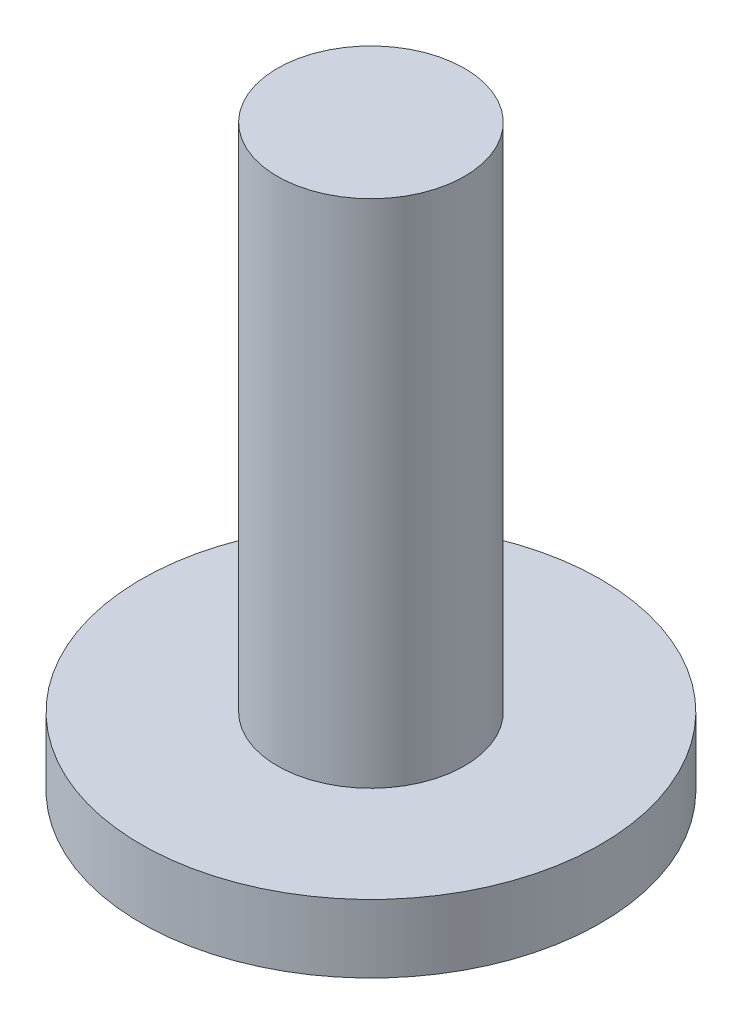
ISO-10303-21;
HEADER;
FILE_DESCRIPTION(('STEP AP214'),'2;1');
FILE_NAME('part.step','',(''),(''),'','','');
FILE_SCHEMA(('AUTOMOTIVE_DESIGN { 1 0 10303 214 1 1 1 1 }'));
ENDSEC;
DATA;
#1=APPLICATION_CONTEXT('core data for automotive mechanical design processes');
#2=APPLICATION_PROTOCOL_DEFINITION('international standard','automotive_design',2000,#1);
#3=PRODUCT_CONTEXT('',#1,'mechanical');
#4=PRODUCT('Part','Part','',(#3));
#5=PRODUCT_RELATED_PRODUCT_CATEGORY('part','',(#4));
#6=PRODUCT_DEFINITION_FORMATION('','',#4);
#7=PRODUCT_DEFINITION_CONTEXT('part definition',#1,'design');
#8=PRODUCT_DEFINITION('design','',#6,#7);
#9=PRODUCT_DEFINITION_SHAPE('','',#8);
#10=(LENGTH_UNIT() NAMED_UNIT(*) SI_UNIT(.MILLI.,.METRE.));
#11=(NAMED_UNIT(*) PLANE_ANGLE_UNIT() SI_UNIT($,.RADIAN.));
#12=(NAMED_UNIT(*) SI_UNIT($,.STERADIAN.) SOLID_ANGLE_UNIT());
#13=UNCERTAINTY_MEASURE_WITH_UNIT(LENGTH_MEASURE(1.E-05),#10,'distance_accuracy_value','');
#14=(GEOMETRIC_REPRESENTATION_CONTEXT(3) GLOBAL_UNCERTAINTY_ASSIGNED_CONTEXT((#13)) GLOBAL_UNIT_ASSIGNED_CONTEXT((#10,
#11,#12)) REPRESENTATION_CONTEXT('',''));
#15=CARTESIAN_POINT('',(0.,0.,0.));
#16=DIRECTION('',(0.,0.,1.));
#17=DIRECTION('',(1.,0.,0.));
#18=AXIS2_PLACEMENT_3D('',#15,#16,#17);
#19=CARTESIAN_POINT('',(-0.25,0.,-0.25));
#20=DIRECTION('',(0.,-1.,0.));
#21=DIRECTION('',(0.,0.,-1.));
#22=AXIS2_PLACEMENT_3D('',#19,#20,#21);
#23=PLANE('',#22);
#24=DIRECTION('',(0.,0.,-1.));
#25=VECTOR('',#24,1.);
#26=CARTESIAN_POINT('',(0.25,0.,1.15));
#27=LINE('',#26,#25);
#28=CARTESIAN_POINT('',(0.25,0.,0.25));
#29=VERTEX_POINT('',#28);
#30=CARTESIAN_POINT('',(0.25,0.,1.15));
#31=VERTEX_POINT('',#30);
#32=EDGE_CURVE('E245',#29,#31,#27,.F.);
#33=ORIENTED_EDGE('',*,*,#32,.T.);
#34=DIRECTION('',(1.,0.,0.));
#35=VECTOR('',#34,1.);
#36=CARTESIAN_POINT('',(-0.25,0.,1.15));
#37=LINE('',#36,#35);
#38=CARTESIAN_POINT('',(-0.25,0.,1.15));
#39=VERTEX_POINT('',#38);
#40=EDGE_CURVE('E246',#31,#39,#37,.F.);
#41=ORIENTED_EDGE('',*,*,#40,.T.);
#42=DIRECTION('',(0.,0.,1.));
#43=VECTOR('',#42,1.);
#44=CARTESIAN_POINT('',(-0.25,0.,0.25));
#45=LINE('',#44,#43);
#46=CARTESIAN_POINT('',(-0.25,0.,0.25));
#47=VERTEX_POINT('',#46);
#48=EDGE_CURVE('E243',#39,#47,#45,.F.);
#49=ORIENTED_EDGE('',*,*,#48,.T.);
#50=DIRECTION('',(1.,0.,0.));
#51=VECTOR('',#50,1.);
#52=CARTESIAN_POINT('',(-1.15,0.,0.25));
#53=LINE('',#52,#51);
#54=CARTESIAN_POINT('',(-1.15,0.,0.25));
#55=VERTEX_POINT('',#54);
#56=EDGE_CURVE('E306',#47,#55,#53,.F.);
#57=ORIENTED_EDGE('',*,*,#56,.T.);
#58=DIRECTION('',(0.,0.,1.));
#59=VECTOR('',#58,1.);
#60=CARTESIAN_POINT('',(-1.15,0.,-0.25));
#61=LINE('',#60,#59);
#62=CARTESIAN_POINT('',(-1.15,0.,-0.25));
#63=VERTEX_POINT('',#62);
#64=EDGE_CURVE('E112',#55,#63,#61,.F.);
#65=ORIENTED_EDGE('',*,*,#64,.T.);
#66=DIRECTION('',(-1.,0.,0.));
#67=VECTOR('',#66,1.);
#68=CARTESIAN_POINT('',(-0.25,0.,-0.25));
#69=LINE('',#68,#67);
#70=CARTESIAN_POINT('',(-0.25,0.,-0.25));
#71=VERTEX_POINT('',#70);
#72=EDGE_CURVE('E298',#63,#71,#69,.F.);
#73=ORIENTED_EDGE('',*,*,#72,.T.);
#74=DIRECTION('',(0.,0.,1.));
#75=VECTOR('',#74,1.);
#76=CARTESIAN_POINT('',(-0.25,0.,-1.15));
#77=LINE('',#76,#75);
#78=CARTESIAN_POINT('',(-0.25,0.,-1.15));
#79=VERTEX_POINT('',#78);
#80=EDGE_CURVE('E310',#71,#79,#77,.F.);
#81=ORIENTED_EDGE('',*,*,#80,.T.);
#82=DIRECTION('',(-1.,0.,0.));
#83=VECTOR('',#82,1.);
#84=CARTESIAN_POINT('',(0.25,0.,-1.15));
#85=LINE('',#84,#83);
#86=CARTESIAN_POINT('',(0.25,0.,-1.15));
#87=VERTEX_POINT('',#86);
#88=EDGE_CURVE('E315',#79,#87,#85,.F.);
#89=ORIENTED_EDGE('',*,*,#88,.T.);
#90=DIRECTION('',(0.,0.,-1.));
#91=VECTOR('',#90,1.);
#92=CARTESIAN_POINT('',(0.25,0.,-0.25));
#93=LINE('',#92,#91);
#94=CARTESIAN_POINT('',(0.25,0.,-0.25));
#95=VERTEX_POINT('',#94);
#96=EDGE_CURVE('E320',#87,#95,#93,.F.);
#97=ORIENTED_EDGE('',*,*,#96,.T.);
#98=DIRECTION('',(-1.,0.,0.));
#99=VECTOR('',#98,1.);
#100=CARTESIAN_POINT('',(1.15,0.,-0.25));
#101=LINE('',#100,#99);
#102=CARTESIAN_POINT('',(1.15,0.,-0.25));
#103=VERTEX_POINT('',#102);
#104=EDGE_CURVE('E265',#95,#103,#101,.F.);
#105=ORIENTED_EDGE('',*,*,#104,.T.);
#106=DIRECTION('',(0.,0.,-1.));
#107=VECTOR('',#106,1.);
#108=CARTESIAN_POINT('',(1.15,0.,0.25));
#109=LINE('',#108,#107);
#110=CARTESIAN_POINT('',(1.15,0.,0.25));
#111=VERTEX_POINT('',#110);
#112=EDGE_CURVE('E266',#103,#111,#109,.F.);
#113=ORIENTED_EDGE('',*,*,#112,.T.);
#114=DIRECTION('',(1.,0.,0.));
#115=VECTOR('',#114,1.);
#116=CARTESIAN_POINT('',(0.25,0.,0.25));
#117=LINE('',#116,#115);
#118=EDGE_CURVE('E252',#111,#29,#117,.F.);
#119=ORIENTED_EDGE('',*,*,#118,.T.);
#120=EDGE_LOOP('',(#33,#41,#49,#57,#65,#73,#81,#89,#97,#105,#113,#119));
#121=FACE_BOUND('',#120,.T.);
#122=ADVANCED_FACE('F16',(#121),#23,.T.);
#123=CARTESIAN_POINT('',(-1.15,-0.701,0.25));
#124=DIRECTION('',(0.,0.,1.));
#125=DIRECTION('',(1.,0.,0.));
#126=AXIS2_PLACEMENT_3D('',#123,#124,#125);
#127=PLANE('',#126);
#128=ORIENTED_EDGE('',*,*,#56,.F.);
#129=DIRECTION('',(0.,1.,0.));
#130=VECTOR('',#129,1.);
#131=CARTESIAN_POINT('',(-0.25,-0.701,0.25));
#132=LINE('',#131,#130);
#133=CARTESIAN_POINT('',(-0.250000000000001,-0.684344362627307,0.25));
#134=VERTEX_POINT('',#133);
#135=EDGE_CURVE('E126',#47,#134,#132,.F.);
#136=ORIENTED_EDGE('',*,*,#135,.T.);
#137=CARTESIAN_POINT('',(-1.15,-0.522956970723055,0.249999999999999));
#138=CARTESIAN_POINT('',(-1.11333135868953,-0.533987591681998,0.25));
#139=CARTESIAN_POINT('',(-1.07650393543152,-0.544490328830552,0.25));
#140=CARTESIAN_POINT('',(-1.00265322402775,-0.564407485830237,0.25));
#141=CARTESIAN_POINT('',(-0.965630641332971,-0.573824521468512,0.25));
#142=CARTESIAN_POINT('',(-0.891391412885177,-0.591577534689035,0.25));
#143=CARTESIAN_POINT('',(-0.854175185287187,-0.599915260929063,0.25));
#144=CARTESIAN_POINT('',(-0.779549847545446,-0.615514510882615,0.25));
#145=CARTESIAN_POINT('',(-0.742140921447066,-0.622776915062276,0.25));
#146=CARTESIAN_POINT('',(-0.667130482600741,-0.636227736274504,0.25));
#147=CARTESIAN_POINT('',(-0.629528969852796,-0.642416153307071,0.250000000000002));
#148=CARTESIAN_POINT('',(-0.554133132106234,-0.653718599178492,0.249999999999998));
#149=CARTESIAN_POINT('',(-0.516338673753794,-0.658831738461234,0.249999999999994));
#150=CARTESIAN_POINT('',(-0.440556528913868,-0.667980456534941,0.250000000000006));
#151=CARTESIAN_POINT('',(-0.402568626928616,-0.672014250327762,0.250000000000023));
#152=CARTESIAN_POINT('',(-0.326398825852574,-0.678998670262816,0.249999999999977));
#153=CARTESIAN_POINT('',(-0.288216679361581,-0.681946598480549,0.249999999999914));
#154=CARTESIAN_POINT('',(-0.250000000000439,-0.684344362627288,0.249999999999761));
#155=B_SPLINE_CURVE_WITH_KNOTS('',3,(#137,#138,#139,#140,#141,#142,#143,#144,#145,#146,#147,
#148,#149,#150,#151,#152,#153,#154),.UNSPECIFIED.,.F.,.F.,(4,2,2,2,2,2,2,2,4),(0.,
0.11487148592168,0.229460156947218,0.343860787912718,0.458167224214226,0.572473660515734,
0.686874291481233,0.801462962506772,0.916334448428451),.UNSPECIFIED.);
#156=CARTESIAN_POINT('',(-1.15,-0.522956970723055,0.25));
#157=VERTEX_POINT('',#156);
#158=EDGE_CURVE('E19',#157,#134,#155,.T.);
#159=ORIENTED_EDGE('',*,*,#158,.F.);
#160=DIRECTION('',(0.,1.,0.));
#161=VECTOR('',#160,1.);
#162=CARTESIAN_POINT('',(-1.15,-0.701,0.25));
#163=LINE('',#162,#161);
#164=EDGE_CURVE('E115',#157,#55,#163,.T.);
#165=ORIENTED_EDGE('',*,*,#164,.T.);
#166=EDGE_LOOP('',(#128,#136,#159,#165));
#167=FACE_BOUND('',#166,.T.);
#168=ADVANCED_FACE('F124',(#167),#127,.F.);
#169=CARTESIAN_POINT('',(-0.25,-0.701,0.25));
#170=DIRECTION('',(-1.,0.,0.));
#171=DIRECTION('',(0.,0.,1.));
#172=AXIS2_PLACEMENT_3D('',#169,#170,#171);
#173=PLANE('',#172);
#174=ORIENTED_EDGE('',*,*,#48,.F.);
#175=DIRECTION('',(0.,1.,0.));
#176=VECTOR('',#175,1.);
#177=CARTESIAN_POINT('',(-0.25,-0.701,1.15));
#178=LINE('',#177,#176);
#179=CARTESIAN_POINT('',(-0.25,-0.522956970723054,1.15));
#180=VERTEX_POINT('',#179);
#181=EDGE_CURVE('E242',#39,#180,#178,.F.);
#182=ORIENTED_EDGE('',*,*,#181,.T.);
#183=CARTESIAN_POINT('',(-0.250000000000001,3.3,0.));
#184=DIRECTION('',(-1.,0.,0.));
#185=DIRECTION('',(0.,0.,1.));
#186=AXIS2_PLACEMENT_3D('',#183,#184,#185);
#187=CIRCLE('',#186,3.99217985566783);
#188=EDGE_CURVE('E130',#134,#180,#187,.T.);
#189=ORIENTED_EDGE('',*,*,#188,.F.);
#190=ORIENTED_EDGE('',*,*,#135,.F.);
#191=EDGE_LOOP('',(#174,#182,#189,#190));
#192=FACE_BOUND('',#191,.T.);
#193=ADVANCED_FACE('F230',(#192),#173,.F.);
#194=CARTESIAN_POINT('',(-0.25,-0.701,1.15));
#195=DIRECTION('',(0.,0.,1.));
#196=DIRECTION('',(1.,0.,0.));
#197=AXIS2_PLACEMENT_3D('',#194,#195,#196);
#198=PLANE('',#197);
#199=ORIENTED_EDGE('',*,*,#40,.F.);
#200=DIRECTION('',(0.,1.,0.));
#201=VECTOR('',#200,1.);
#202=CARTESIAN_POINT('',(0.25,-0.701,1.15));
#203=LINE('',#202,#201);
#204=CARTESIAN_POINT('',(0.25,-0.522956970723055,1.15));
#205=VERTEX_POINT('',#204);
#206=EDGE_CURVE('E249',#31,#205,#203,.F.);
#207=ORIENTED_EDGE('',*,*,#206,.T.);
#208=CARTESIAN_POINT('',(-0.25,-0.522956970723054,1.15));
#209=CARTESIAN_POINT('',(-0.166666666666666,-0.528400690839758,1.15));
#210=CARTESIAN_POINT('',(-0.0833333333333331,-0.531122550898111,1.15));
#211=CARTESIAN_POINT('',(0.0833333333333335,-0.531122550898111,1.15));
#212=CARTESIAN_POINT('',(0.166666666666667,-0.528400690839758,1.15));
#213=CARTESIAN_POINT('',(0.25,-0.522956970723054,1.15));
#214=B_SPLINE_CURVE_WITH_KNOTS('',3,(#208,#209,#210,#211,#212,#213),.UNSPECIFIED.,.F.,.F.,(4,2,
4),(0.,0.250133317851891,0.500266635703782),.UNSPECIFIED.);
#215=EDGE_CURVE('E232',#180,#205,#214,.T.);
#216=ORIENTED_EDGE('',*,*,#215,.F.);
#217=ORIENTED_EDGE('',*,*,#181,.F.);
#218=EDGE_LOOP('',(#199,#207,#216,#217));
#219=FACE_BOUND('',#218,.T.);
#220=ADVANCED_FACE('F225',(#219),#198,.F.);
#221=CARTESIAN_POINT('',(0.25,-0.701,1.15));
#222=DIRECTION('',(1.,0.,0.));
#223=DIRECTION('',(0.,0.,-1.));
#224=AXIS2_PLACEMENT_3D('',#221,#222,#223);
#225=PLANE('',#224);
#226=ORIENTED_EDGE('',*,*,#32,.F.);
#227=DIRECTION('',(0.,1.,0.));
#228=VECTOR('',#227,1.);
#229=CARTESIAN_POINT('',(0.25,-0.701,0.25));
#230=LINE('',#229,#228);
#231=CARTESIAN_POINT('',(0.25,-0.684344362627306,0.250000000000001));
#232=VERTEX_POINT('',#231);
#233=EDGE_CURVE('E255',#29,#232,#230,.F.);
#234=ORIENTED_EDGE('',*,*,#233,.T.);
#235=CARTESIAN_POINT('',(0.25,3.3,0.));
#236=DIRECTION('',(-1.,0.,0.));
#237=DIRECTION('',(0.,0.,1.));
#238=AXIS2_PLACEMENT_3D('',#235,#236,#237);
#239=CIRCLE('',#238,3.99217985566783);
#240=EDGE_CURVE('E215',#205,#232,#239,.F.);
#241=ORIENTED_EDGE('',*,*,#240,.F.);
#242=ORIENTED_EDGE('',*,*,#206,.F.);
#243=EDGE_LOOP('',(#226,#234,#241,#242));
#244=FACE_BOUND('',#243,.T.);
#245=ADVANCED_FACE('F221',(#244),#225,.F.);
#246=CARTESIAN_POINT('',(0.25,-0.701,0.25));
#247=DIRECTION('',(0.,0.,1.));
#248=DIRECTION('',(1.,0.,0.));
#249=AXIS2_PLACEMENT_3D('',#246,#247,#248);
#250=PLANE('',#249);
#251=ORIENTED_EDGE('',*,*,#118,.F.);
#252=DIRECTION('',(0.,1.,0.));
#253=VECTOR('',#252,1.);
#254=CARTESIAN_POINT('',(1.15,-0.701,0.25));
#255=LINE('',#254,#253);
#256=CARTESIAN_POINT('',(1.15,-0.522956970723055,0.25));
#257=VERTEX_POINT('',#256);
#258=EDGE_CURVE('E262',#111,#257,#255,.F.);
#259=ORIENTED_EDGE('',*,*,#258,.T.);
#260=CARTESIAN_POINT('',(0.25,-0.684344362627307,0.250000000000001));
#261=CARTESIAN_POINT('',(0.288216679361161,-0.681946598480576,0.25));
#262=CARTESIAN_POINT('',(0.326398825852173,-0.678998670262848,0.25));
#263=CARTESIAN_POINT('',(0.402568626928252,-0.6720142503278,0.25));
#264=CARTESIAN_POINT('',(0.440556528913523,-0.66798045653498,0.25));
#265=CARTESIAN_POINT('',(0.516338673753486,-0.658831738461274,0.25));
#266=CARTESIAN_POINT('',(0.554133132105944,-0.653718599178532,0.25));
#267=CARTESIAN_POINT('',(0.629528969852543,-0.642416153307111,0.25));
#268=CARTESIAN_POINT('',(0.667130482600507,-0.636227736274544,0.25));
#269=CARTESIAN_POINT('',(0.742140921446868,-0.622776915062314,0.25));
#270=CARTESIAN_POINT('',(0.779549847545266,-0.615514510882651,0.25));
#271=CARTESIAN_POINT('',(0.854175185287044,-0.599915260929095,0.25));
#272=CARTESIAN_POINT('',(0.891391412885051,-0.591577534689064,0.25));
#273=CARTESIAN_POINT('',(0.965630641332881,-0.573824521468535,0.25));
#274=CARTESIAN_POINT('',(1.00265322402768,-0.564407485830255,0.25));
#275=CARTESIAN_POINT('',(1.07650393543148,-0.544490328830562,0.25));
#276=CARTESIAN_POINT('',(1.11333135868951,-0.533987591682003,0.250000000000001));
#277=CARTESIAN_POINT('',(1.15,-0.522956970723055,0.250000000000002));
#278=B_SPLINE_CURVE_WITH_KNOTS('',3,(#260,#261,#262,#263,#264,#265,#266,#267,#268,#269,#270,
#271,#272,#273,#274,#275,#276,#277),.UNSPECIFIED.,.F.,.F.,(4,2,2,2,2,2,2,2,4),(0.,
0.114871485921735,0.229460156947329,0.343860787912883,0.458167224214445,0.572473660516008,
0.686874291481562,0.801462962507155,0.91633444842889),.UNSPECIFIED.);
#279=EDGE_CURVE('E208',#232,#257,#278,.T.);
#280=ORIENTED_EDGE('',*,*,#279,.F.);
#281=ORIENTED_EDGE('',*,*,#233,.F.);
#282=EDGE_LOOP('',(#251,#259,#280,#281));
#283=FACE_BOUND('',#282,.T.);
#284=ADVANCED_FACE('F217',(#283),#250,.F.);
#285=CARTESIAN_POINT('',(1.15,-0.701,0.25));
#286=DIRECTION('',(1.,0.,0.));
#287=DIRECTION('',(0.,0.,-1.));
#288=AXIS2_PLACEMENT_3D('',#285,#286,#287);
#289=PLANE('',#288);
#290=ORIENTED_EDGE('',*,*,#112,.F.);
#291=DIRECTION('',(0.,1.,0.));
#292=VECTOR('',#291,1.);
#293=CARTESIAN_POINT('',(1.15,-0.701,-0.25));
#294=LINE('',#293,#292);
#295=CARTESIAN_POINT('',(1.15,-0.522956970723055,-0.25));
#296=VERTEX_POINT('',#295);
#297=EDGE_CURVE('E322',#103,#296,#294,.F.);
#298=ORIENTED_EDGE('',*,*,#297,.T.);
#299=CARTESIAN_POINT('',(1.15,-0.531122550898105,0.));
#300=CARTESIAN_POINT('',(1.15,-0.531122550898105,-0.125133353399194));
#301=CARTESIAN_POINT('',(1.15,-0.522956970723055,-0.25));
#302=B_SPLINE_CURVE_WITH_KNOTS('',2,(#299,#300,#301),.UNSPECIFIED.,.F.,.F.,(3,3),(0.,1.),.UNSPECIFIED.);
#303=CARTESIAN_POINT('',(1.15,-0.531122550898105,0.));
#304=VERTEX_POINT('',#303);
#305=EDGE_CURVE('E207',#304,#296,#302,.T.);
#306=ORIENTED_EDGE('',*,*,#305,.F.);
#307=CARTESIAN_POINT('',(1.15,-0.522956970723055,0.25));
#308=CARTESIAN_POINT('',(1.15,-0.531122550898105,0.125133353399195));
#309=CARTESIAN_POINT('',(1.15,-0.531122550898105,0.));
#310=B_SPLINE_CURVE_WITH_KNOTS('',2,(#307,#308,#309),.UNSPECIFIED.,.F.,.F.,(3,3),(0.,1.),.UNSPECIFIED.);
#311=EDGE_CURVE('E214',#257,#304,#310,.T.);
#312=ORIENTED_EDGE('',*,*,#311,.F.);
#313=ORIENTED_EDGE('',*,*,#258,.F.);
#314=EDGE_LOOP('',(#290,#298,#306,#312,#313));
#315=FACE_BOUND('',#314,.T.);
#316=ADVANCED_FACE('F197',(#315),#289,.F.);
#317=CARTESIAN_POINT('',(1.15,-0.701,-0.25));
#318=DIRECTION('',(0.,0.,-1.));
#319=DIRECTION('',(-1.,0.,0.));
#320=AXIS2_PLACEMENT_3D('',#317,#318,#319);
#321=PLANE('',#320);
#322=ORIENTED_EDGE('',*,*,#104,.F.);
#323=DIRECTION('',(0.,1.,0.));
#324=VECTOR('',#323,1.);
#325=CARTESIAN_POINT('',(0.25,-0.701,-0.25));
#326=LINE('',#325,#324);
#327=CARTESIAN_POINT('',(0.25,-0.684344362627307,-0.25));
#328=VERTEX_POINT('',#327);
#329=EDGE_CURVE('E317',#95,#328,#326,.F.);
#330=ORIENTED_EDGE('',*,*,#329,.T.);
#331=CARTESIAN_POINT('',(1.15,-0.522956970723055,-0.250000000000001));
#332=CARTESIAN_POINT('',(1.11333135868953,-0.533987591681999,-0.25));
#333=CARTESIAN_POINT('',(1.07650393543152,-0.544490328830553,-0.25));
#334=CARTESIAN_POINT('',(1.00265322402775,-0.564407485830237,-0.25));
#335=CARTESIAN_POINT('',(0.96563064133297,-0.573824521468512,-0.25));
#336=CARTESIAN_POINT('',(0.891391412885177,-0.591577534689035,-0.25));
#337=CARTESIAN_POINT('',(0.854175185287187,-0.599915260929063,-0.25));
#338=CARTESIAN_POINT('',(0.779549847545446,-0.615514510882615,-0.25));
#339=CARTESIAN_POINT('',(0.742140921447065,-0.622776915062276,-0.249999999999999));
#340=CARTESIAN_POINT('',(0.667130482600741,-0.636227736274504,-0.25));
#341=CARTESIAN_POINT('',(0.629528969852796,-0.642416153307071,-0.250000000000001));
#342=CARTESIAN_POINT('',(0.554133132106233,-0.653718599178492,-0.249999999999998));
#343=CARTESIAN_POINT('',(0.516338673753794,-0.658831738461234,-0.249999999999994));
#344=CARTESIAN_POINT('',(0.440556528913867,-0.667980456534941,-0.250000000000006));
#345=CARTESIAN_POINT('',(0.402568626928615,-0.672014250327762,-0.250000000000023));
#346=CARTESIAN_POINT('',(0.326398825852573,-0.678998670262816,-0.249999999999977));
#347=CARTESIAN_POINT('',(0.28821667936158,-0.681946598480549,-0.249999999999914));
#348=CARTESIAN_POINT('',(0.250000000000439,-0.684344362627288,-0.24999999999976));
#349=B_SPLINE_CURVE_WITH_KNOTS('',3,(#331,#332,#333,#334,#335,#336,#337,#338,#339,#340,#341,
#342,#343,#344,#345,#346,#347,#348),.UNSPECIFIED.,.F.,.F.,(4,2,2,2,2,2,2,2,4),(0.,
0.11487148592168,0.229460156947218,0.343860787912718,0.458167224214226,0.572473660515734,
0.686874291481233,0.801462962506772,0.916334448428451),.UNSPECIFIED.);
#350=EDGE_CURVE('E201',#296,#328,#349,.T.);
#351=ORIENTED_EDGE('',*,*,#350,.F.);
#352=ORIENTED_EDGE('',*,*,#297,.F.);
#353=EDGE_LOOP('',(#322,#330,#351,#352));
#354=FACE_BOUND('',#353,.T.);
#355=ADVANCED_FACE('F192',(#354),#321,.F.);
#356=CARTESIAN_POINT('',(0.25,-0.701,-0.25));
#357=DIRECTION('',(1.,0.,0.));
#358=DIRECTION('',(0.,0.,-1.));
#359=AXIS2_PLACEMENT_3D('',#356,#357,#358);
#360=PLANE('',#359);
#361=ORIENTED_EDGE('',*,*,#96,.F.);
#362=DIRECTION('',(0.,1.,0.));
#363=VECTOR('',#362,1.);
#364=CARTESIAN_POINT('',(0.25,-0.701,-1.15));
#365=LINE('',#364,#363);
#366=CARTESIAN_POINT('',(0.25,-0.522956970723054,-1.15));
#367=VERTEX_POINT('',#366);
#368=EDGE_CURVE('E312',#87,#367,#365,.F.);
#369=ORIENTED_EDGE('',*,*,#368,.T.);
#370=CARTESIAN_POINT('',(0.25,3.3,0.));
#371=DIRECTION('',(-1.,0.,0.));
#372=DIRECTION('',(0.,0.,1.));
#373=AXIS2_PLACEMENT_3D('',#370,#371,#372);
#374=CIRCLE('',#373,3.99217985566783);
#375=EDGE_CURVE('E182',#328,#367,#374,.F.);
#376=ORIENTED_EDGE('',*,*,#375,.F.);
#377=ORIENTED_EDGE('',*,*,#329,.F.);
#378=EDGE_LOOP('',(#361,#369,#376,#377));
#379=FACE_BOUND('',#378,.T.);
#380=ADVANCED_FACE('F188',(#379),#360,.F.);
#381=CARTESIAN_POINT('',(0.25,-0.701,-1.15));
#382=DIRECTION('',(0.,0.,-1.));
#383=DIRECTION('',(-1.,0.,0.));
#384=AXIS2_PLACEMENT_3D('',#381,#382,#383);
#385=PLANE('',#384);
#386=ORIENTED_EDGE('',*,*,#88,.F.);
#387=DIRECTION('',(0.,1.,0.));
#388=VECTOR('',#387,1.);
#389=CARTESIAN_POINT('',(-0.25,-0.701,-1.15));
#390=LINE('',#389,#388);
#391=CARTESIAN_POINT('',(-0.25,-0.522956970723055,-1.15));
#392=VERTEX_POINT('',#391);
#393=EDGE_CURVE('E300',#79,#392,#390,.F.);
#394=ORIENTED_EDGE('',*,*,#393,.T.);
#395=CARTESIAN_POINT('',(0.25,-0.522956970723054,-1.15));
#396=CARTESIAN_POINT('',(0.166666666666667,-0.528400690839758,-1.15));
#397=CARTESIAN_POINT('',(0.0833333333333335,-0.531122550898111,-1.15));
#398=CARTESIAN_POINT('',(-0.0833333333333331,-0.531122550898111,-1.15));
#399=CARTESIAN_POINT('',(-0.166666666666666,-0.528400690839758,-1.15));
#400=CARTESIAN_POINT('',(-0.25,-0.522956970723054,-1.15));
#401=B_SPLINE_CURVE_WITH_KNOTS('',3,(#395,#396,#397,#398,#399,#400),.UNSPECIFIED.,.F.,.F.,(4,2,
4),(0.,0.250133317851891,0.500266635703782),.UNSPECIFIED.);
#402=EDGE_CURVE('E176',#367,#392,#401,.T.);
#403=ORIENTED_EDGE('',*,*,#402,.F.);
#404=ORIENTED_EDGE('',*,*,#368,.F.);
#405=EDGE_LOOP('',(#386,#394,#403,#404));
#406=FACE_BOUND('',#405,.T.);
#407=ADVANCED_FACE('F184',(#406),#385,.F.);
#408=CARTESIAN_POINT('',(-0.25,-0.701,-1.15));
#409=DIRECTION('',(-1.,0.,0.));
#410=DIRECTION('',(0.,0.,1.));
#411=AXIS2_PLACEMENT_3D('',#408,#409,#410);
#412=PLANE('',#411);
#413=ORIENTED_EDGE('',*,*,#80,.F.);
#414=DIRECTION('',(0.,1.,0.));
#415=VECTOR('',#414,1.);
#416=CARTESIAN_POINT('',(-0.25,-0.701,-0.25));
#417=LINE('',#416,#415);
#418=CARTESIAN_POINT('',(-0.25,-0.684344362627306,-0.25));
#419=VERTEX_POINT('',#418);
#420=EDGE_CURVE('E121',#71,#419,#417,.F.);
#421=ORIENTED_EDGE('',*,*,#420,.T.);
#422=CARTESIAN_POINT('',(-0.249999999999999,3.3,0.));
#423=DIRECTION('',(-1.,0.,0.));
#424=DIRECTION('',(0.,0.,1.));
#425=AXIS2_PLACEMENT_3D('',#422,#423,#424);
#426=CIRCLE('',#425,3.99217985566783);
#427=EDGE_CURVE('E169',#392,#419,#426,.T.);
#428=ORIENTED_EDGE('',*,*,#427,.F.);
#429=ORIENTED_EDGE('',*,*,#393,.F.);
#430=EDGE_LOOP('',(#413,#421,#428,#429));
#431=FACE_BOUND('',#430,.T.);
#432=ADVANCED_FACE('F159',(#431),#412,.F.);
#433=CARTESIAN_POINT('',(-0.25,-0.701,-0.25));
#434=DIRECTION('',(0.,0.,-1.));
#435=DIRECTION('',(-1.,0.,0.));
#436=AXIS2_PLACEMENT_3D('',#433,#434,#435);
#437=PLANE('',#436);
#438=ORIENTED_EDGE('',*,*,#72,.F.);
#439=DIRECTION('',(0.,1.,0.));
#440=VECTOR('',#439,1.);
#441=CARTESIAN_POINT('',(-1.15,-0.701,-0.25));
#442=LINE('',#441,#440);
#443=CARTESIAN_POINT('',(-1.15,-0.522956970723055,-0.25));
#444=VERTEX_POINT('',#443);
#445=EDGE_CURVE('E135',#63,#444,#442,.F.);
#446=ORIENTED_EDGE('',*,*,#445,.T.);
#447=CARTESIAN_POINT('',(-0.25,-0.684344362627307,-0.25));
#448=CARTESIAN_POINT('',(-0.28821667936116,-0.681946598480576,-0.25));
#449=CARTESIAN_POINT('',(-0.326398825852172,-0.678998670262848,-0.25));
#450=CARTESIAN_POINT('',(-0.402568626928252,-0.6720142503278,-0.25));
#451=CARTESIAN_POINT('',(-0.440556528913522,-0.66798045653498,-0.25));
#452=CARTESIAN_POINT('',(-0.516338673753486,-0.658831738461274,-0.25));
#453=CARTESIAN_POINT('',(-0.554133132105944,-0.653718599178532,-0.25));
#454=CARTESIAN_POINT('',(-0.629528969852543,-0.642416153307111,-0.25));
#455=CARTESIAN_POINT('',(-0.667130482600507,-0.636227736274544,-0.25));
#456=CARTESIAN_POINT('',(-0.742140921446868,-0.622776915062314,-0.25));
#457=CARTESIAN_POINT('',(-0.779549847545266,-0.615514510882651,-0.25));
#458=CARTESIAN_POINT('',(-0.854175185287044,-0.599915260929095,-0.25));
#459=CARTESIAN_POINT('',(-0.891391412885052,-0.591577534689064,-0.25));
#460=CARTESIAN_POINT('',(-0.965630641332882,-0.573824521468535,-0.25));
#461=CARTESIAN_POINT('',(-1.00265322402768,-0.564407485830255,-0.25));
#462=CARTESIAN_POINT('',(-1.07650393543148,-0.544490328830562,-0.25));
#463=CARTESIAN_POINT('',(-1.11333135868951,-0.533987591682003,-0.25));
#464=CARTESIAN_POINT('',(-1.15,-0.522956970723055,-0.250000000000001));
#465=B_SPLINE_CURVE_WITH_KNOTS('',3,(#447,#448,#449,#450,#451,#452,#453,#454,#455,#456,#457,
#458,#459,#460,#461,#462,#463,#464),.UNSPECIFIED.,.F.,.F.,(4,2,2,2,2,2,2,2,4),(0.,
0.114871485921735,0.229460156947329,0.343860787912883,0.458167224214446,0.572473660516008,
0.686874291481562,0.801462962507156,0.916334448428891),.UNSPECIFIED.);
#466=EDGE_CURVE('E163',#419,#444,#465,.T.);
#467=ORIENTED_EDGE('',*,*,#466,.F.);
#468=ORIENTED_EDGE('',*,*,#420,.F.);
#469=EDGE_LOOP('',(#438,#446,#467,#468));
#470=FACE_BOUND('',#469,.T.);
#471=ADVANCED_FACE('F152',(#470),#437,.F.);
#472=CARTESIAN_POINT('',(-1.15,-0.701,-0.25));
#473=DIRECTION('',(-1.,0.,0.));
#474=DIRECTION('',(0.,0.,1.));
#475=AXIS2_PLACEMENT_3D('',#472,#473,#474);
#476=PLANE('',#475);
#477=ORIENTED_EDGE('',*,*,#64,.F.);
#478=ORIENTED_EDGE('',*,*,#164,.F.);
#479=CARTESIAN_POINT('',(-1.15,-0.531122550898105,0.));
#480=CARTESIAN_POINT('',(-1.15,-0.531122550898105,0.125133353399194));
#481=CARTESIAN_POINT('',(-1.15,-0.522956970723055,0.25));
#482=B_SPLINE_CURVE_WITH_KNOTS('',2,(#479,#480,#481),.UNSPECIFIED.,.F.,.F.,(3,3),(0.,1.),.UNSPECIFIED.);
#483=CARTESIAN_POINT('',(-1.15,-0.531122550898105,0.));
#484=VERTEX_POINT('',#483);
#485=EDGE_CURVE('E37',#484,#157,#482,.T.);
#486=ORIENTED_EDGE('',*,*,#485,.F.);
#487=CARTESIAN_POINT('',(-1.15,-0.522956970723055,-0.25));
#488=CARTESIAN_POINT('',(-1.15,-0.531122550898105,-0.125133353399195));
#489=CARTESIAN_POINT('',(-1.15,-0.531122550898105,0.));
#490=B_SPLINE_CURVE_WITH_KNOTS('',2,(#487,#488,#489),.UNSPECIFIED.,.F.,.F.,(3,3),(0.,1.),.UNSPECIFIED.);
#491=EDGE_CURVE('E134',#444,#484,#490,.T.);
#492=ORIENTED_EDGE('',*,*,#491,.F.);
#493=ORIENTED_EDGE('',*,*,#445,.F.);
#494=EDGE_LOOP('',(#477,#478,#486,#492,#493));
#495=FACE_BOUND('',#494,.T.);
#496=ADVANCED_FACE('F117',(#495),#476,.F.);
#497=CARTESIAN_POINT('',(0.,3.3,0.));
#498=DIRECTION('',(-1.,0.,0.));
#499=DIRECTION('',(0.,1.,0.));
#500=AXIS2_PLACEMENT_3D('',#497,#498,#499);
#501=SPHERICAL_SURFACE('',#500,4.);
#502=ORIENTED_EDGE('',*,*,#311,.T.);
#503=ORIENTED_EDGE('',*,*,#305,.T.);
#504=ORIENTED_EDGE('',*,*,#350,.T.);
#505=ORIENTED_EDGE('',*,*,#375,.T.);
#506=ORIENTED_EDGE('',*,*,#402,.T.);
#507=ORIENTED_EDGE('',*,*,#427,.T.);
#508=ORIENTED_EDGE('',*,*,#466,.T.);
#509=ORIENTED_EDGE('',*,*,#491,.T.);
#510=ORIENTED_EDGE('',*,*,#485,.T.);
#511=ORIENTED_EDGE('',*,*,#158,.T.);
#512=ORIENTED_EDGE('',*,*,#188,.T.);
#513=ORIENTED_EDGE('',*,*,#215,.T.);
#514=ORIENTED_EDGE('',*,*,#240,.T.);
#515=ORIENTED_EDGE('',*,*,#279,.T.);
#516=EDGE_LOOP('',(#502,#503,#504,#505,#506,#507,#508,#509,#510,#511,#512,#513,#514,#515));
#517=FACE_BOUND('',#516,.T.);
#518=CARTESIAN_POINT('',(-2.26053091109146,0.,0.));
#519=CARTESIAN_POINT('',(-2.26053053074476,0.,-0.0634686189548611));
#520=CARTESIAN_POINT('',(-2.2578555216043,0.,-0.126948901982905));
#521=CARTESIAN_POINT('',(-2.24717287637256,0.,-0.253470780448168));
#522=CARTESIAN_POINT('',(-2.23916366592274,0.,-0.316512240817202));
#523=CARTESIAN_POINT('',(-2.21784865179328,0.,-0.441802471204869));
#524=CARTESIAN_POINT('',(-2.20453444037596,-2.98126440261469E-13,-0.504049820264297));
#525=CARTESIAN_POINT('',(-2.1727012014385,2.98368876114298E-13,-0.627236238861379));
#526=CARTESIAN_POINT('',(-2.1541779501764,1.11409591192547E-12,-0.688174203344999));
#527=CARTESIAN_POINT('',(-2.09105073065862,2.00138662027117E-12,-0.868110337196722));
#528=CARTESIAN_POINT('',(-2.03883744497422,5.24365645461107E-13,-0.98453356427951));
#529=CARTESIAN_POINT('',(-1.9155784879813,-5.24385580927185E-13,-1.2069487261415));
#530=CARTESIAN_POINT('',(-1.84453210077384,0.,-1.31294026417291));
#531=CARTESIAN_POINT('',(-1.72545514538517,0.,-1.46180097936952));
#532=CARTESIAN_POINT('',(-1.68364682599697,0.,-1.50976149427961));
#533=CARTESIAN_POINT('',(-1.59617149477225,0.,-1.60195696908215));
#534=CARTESIAN_POINT('',(-1.55050824216089,0.,-1.64619547638732));
#535=CARTESIAN_POINT('',(-1.45559544839084,0.,-1.73068779109095));
#536=CARTESIAN_POINT('',(-1.40634429204368,0.,-1.77093978437596));
#537=CARTESIAN_POINT('',(-1.30463062791458,0.,-1.84715570720789));
#538=CARTESIAN_POINT('',(-1.25216737898934,0.,-1.88311864143146));
#539=CARTESIAN_POINT('',(-1.09053154901924,0.,-1.98414847415446));
#540=CARTESIAN_POINT('',(-0.97701258024434,0.,-2.04244552987264));
#541=CARTESIAN_POINT('',(-0.74185982723409,0.,-2.13911848928453));
#542=CARTESIAN_POINT('',(-0.620226129683492,0.,-2.17749460574319));
#543=CARTESIAN_POINT('',(-0.372226662969414,0.,-2.23329188356453));
#544=CARTESIAN_POINT('',(-0.245860868538245,0.,-2.25071293301826));
#545=CARTESIAN_POINT('',(0.00800172198751564,0.,-2.26408750846331));
#546=CARTESIAN_POINT('',(0.135498518082107,1.00177102569383E-13,-2.26004103445464));
#547=CARTESIAN_POINT('',(0.387988091309287,0.,-2.23061167642096));
#548=CARTESIAN_POINT('',(0.512980881810631,0.,-2.20522890634044));
#549=CARTESIAN_POINT('',(0.756989952105564,0.,-2.13380025702119));
#550=CARTESIAN_POINT('',(0.87600616805097,1.09044418485208E-13,-2.08775415708679));
#551=CARTESIAN_POINT('',(1.04736310520717,0.,-2.0042678185719));
#552=CARTESIAN_POINT('',(1.1033147984167,0.,-1.97401665078041));
#553=CARTESIAN_POINT('',(1.21247392295783,0.,-1.9089104153408));
#554=CARTESIAN_POINT('',(1.26568198674426,0.,-1.87405641538309));
#555=CARTESIAN_POINT('',(1.36894754805191,0.,-1.80000499059575));
#556=CARTESIAN_POINT('',(1.41900646119855,0.,-1.7608095395559));
#557=CARTESIAN_POINT('',(1.51568515774701,0.,-1.6783160926609));
#558=CARTESIAN_POINT('',(1.56230157548578,0.,-1.63501417402321));
#559=CARTESIAN_POINT('',(1.69636116400146,1.62226807366217E-13,-1.49948978300649));
#560=CARTESIAN_POINT('',(1.77815151409551,0.,-1.40155034303975));
#561=CARTESIAN_POINT('',(1.9240988310405,0.,-1.19331812799723));
#562=CARTESIAN_POINT('',(1.98825646813816,0.,-1.08302582269736));
#563=CARTESIAN_POINT('',(2.06994136401175,0.,-0.910719015241035));
#564=CARTESIAN_POINT('',(2.09476524861796,0.,-0.852064764706219));
#565=CARTESIAN_POINT('',(2.13936631665933,0.,-0.732905234841219));
#566=CARTESIAN_POINT('',(2.15914758433849,0.,-0.67240149826558));
#567=CARTESIAN_POINT('',(2.19350971764669,0.,-0.550044579979405));
#568=CARTESIAN_POINT('',(2.20809879515888,0.,-0.488193694821333));
#569=CARTESIAN_POINT('',(2.23201683722088,0.,-0.36349472969543));
#570=CARTESIAN_POINT('',(2.24134735322116,0.,-0.300646949476875));
#571=CARTESIAN_POINT('',(2.25218488617317,0.,-0.198084800346749));
#572=CARTESIAN_POINT('',(2.2553136550871,0.,-0.158534640690645));
#573=CARTESIAN_POINT('',(2.25948678639453,0.,-0.0793245058589064));
#574=CARTESIAN_POINT('',(2.26053114878804,0.,-0.0396645306832723));
#575=CARTESIAN_POINT('',(2.26053053074476,0.,0.0634686189548603));
#576=CARTESIAN_POINT('',(2.2578555216043,0.,0.126948901982904));
#577=CARTESIAN_POINT('',(2.24717287637256,0.,0.253470780448167));
#578=CARTESIAN_POINT('',(2.23916366592274,0.,0.316512240817201));
#579=CARTESIAN_POINT('',(2.21784865179328,0.,0.441802471204868));
#580=CARTESIAN_POINT('',(2.20453444037596,-2.98126435331234E-13,0.504049820264296));
#581=CARTESIAN_POINT('',(2.1727012014385,2.98368871180054E-13,0.627236238861378));
#582=CARTESIAN_POINT('',(2.1541779501764,1.1140959102065E-12,0.688174203344998));
#583=CARTESIAN_POINT('',(2.09105073065862,2.0013866237009E-12,0.868110337196721));
#584=CARTESIAN_POINT('',(2.03883744497423,5.24365646363847E-13,0.984533564279509));
#585=CARTESIAN_POINT('',(1.91557848798131,-5.2438558182996E-13,1.2069487261415));
#586=CARTESIAN_POINT('',(1.84453210077384,0.,1.31294026417291));
#587=CARTESIAN_POINT('',(1.72545514538518,0.,1.46180097936952));
#588=CARTESIAN_POINT('',(1.68364682599697,0.,1.50976149427961));
#589=CARTESIAN_POINT('',(1.59617149477225,0.,1.60195696908215));
#590=CARTESIAN_POINT('',(1.55050824216089,0.,1.64619547638732));
#591=CARTESIAN_POINT('',(1.45559544839085,0.,1.73068779109095));
#592=CARTESIAN_POINT('',(1.40634429204368,0.,1.77093978437596));
#593=CARTESIAN_POINT('',(1.30463062791458,0.,1.84715570720789));
#594=CARTESIAN_POINT('',(1.25216737898934,0.,1.88311864143146));
#595=CARTESIAN_POINT('',(1.09053154901924,0.,1.98414847415446));
#596=CARTESIAN_POINT('',(0.977012580244343,0.,2.04244552987264));
#597=CARTESIAN_POINT('',(0.741859827234093,0.,2.13911848928453));
#598=CARTESIAN_POINT('',(0.620226129683495,0.,2.17749460574319));
#599=CARTESIAN_POINT('',(0.372226662969416,0.,2.23329188356453));
#600=CARTESIAN_POINT('',(0.245860868538247,0.,2.25071293301826));
#601=CARTESIAN_POINT('',(-0.00800172198751346,0.,2.26408750846331));
#602=CARTESIAN_POINT('',(-0.135498518082105,1.00176398622143E-13,2.26004103445464));
#603=CARTESIAN_POINT('',(-0.387988091309284,0.,2.23061167642096));
#604=CARTESIAN_POINT('',(-0.512980881810629,0.,2.20522890634044));
#605=CARTESIAN_POINT('',(-0.756989952105562,0.,2.13380025702119));
#606=CARTESIAN_POINT('',(-0.876006168050969,1.0903461360376E-13,2.08775415708679));
#607=CARTESIAN_POINT('',(-1.04736310520716,0.,2.0042678185719));
#608=CARTESIAN_POINT('',(-1.1033147984167,0.,1.97401665078041));
#609=CARTESIAN_POINT('',(-1.21247392295783,0.,1.9089104153408));
#610=CARTESIAN_POINT('',(-1.26568198674426,0.,1.87405641538309));
#611=CARTESIAN_POINT('',(-1.36894754805191,0.,1.80000499059575));
#612=CARTESIAN_POINT('',(-1.41900646119854,0.,1.7608095395559));
#613=CARTESIAN_POINT('',(-1.515685157747,0.,1.6783160926609));
#614=CARTESIAN_POINT('',(-1.56230157548577,0.,1.63501417402321));
#615=CARTESIAN_POINT('',(-1.69636116400145,1.61054250266303E-13,1.49948978300649));
#616=CARTESIAN_POINT('',(-1.77815151409551,0.,1.40155034303975));
#617=CARTESIAN_POINT('',(-1.9240988310405,0.,1.19331812799723));
#618=CARTESIAN_POINT('',(-1.98825646813816,0.,1.08302582269736));
#619=CARTESIAN_POINT('',(-2.06994136401175,0.,0.910719015241037));
#620=CARTESIAN_POINT('',(-2.09476524861796,0.,0.852064764706221));
#621=CARTESIAN_POINT('',(-2.13936631665933,0.,0.732905234841222));
#622=CARTESIAN_POINT('',(-2.15914758433849,0.,0.672401498265582));
#623=CARTESIAN_POINT('',(-2.19350971764669,0.,0.550044579979407));
#624=CARTESIAN_POINT('',(-2.20809879515888,0.,0.488193694821335));
#625=CARTESIAN_POINT('',(-2.23201683722088,0.,0.363494729695432));
#626=CARTESIAN_POINT('',(-2.24134735322117,0.,0.300646949476877));
#627=CARTESIAN_POINT('',(-2.25218488617317,0.,0.198084800346751));
#628=CARTESIAN_POINT('',(-2.2553136550871,0.,0.158534640690646));
#629=CARTESIAN_POINT('',(-2.25948678639453,0.,0.0793245058589066));
#630=CARTESIAN_POINT('',(-2.26053114878804,0.,0.0396645306832719));
#631=CARTESIAN_POINT('',(-2.26053091109146,0.,0.));
#632=B_SPLINE_CURVE_WITH_KNOTS('',3,(#518,#519,#520,#521,#522,#523,#524,#525,#526,#527,#528,
#529,#530,#531,#532,#533,#534,#535,#536,#537,#538,#539,#540,#541,#542,#543,#544,#545,#546,#547,
#548,#549,#550,#551,#552,#553,#554,#555,#556,#557,#558,#559,#560,#561,#562,#563,#564,#565,#566,
#567,#568,#569,#570,#571,#572,#573,#574,#575,#576,#577,#578,#579,#580,#581,#582,#583,#584,#585,
#586,#587,#588,#589,#590,#591,#592,#593,#594,#595,#596,#597,#598,#599,#600,#601,#602,#603,#604,
#605,#606,#607,#608,#609,#610,#611,#612,#613,#614,#615,#616,#617,#618,#619,#620,#621,#622,#623,
#624,#625,#626,#627,#628,#629,#630,#631),.UNSPECIFIED.,.T.,.F.,(4,2,2,2,2,2,2,2,2,2,2,2,2,2,2,2,
2,2,2,2,2,2,2,2,2,2,2,2,2,2,2,2,2,2,2,2,2,2,2,2,2,2,2,2,2,2,2,2,2,2,2,2,2,2,2,2,4),(0.,
0.190369341904712,0.380794895128831,0.571523456281819,0.762407117537104,1.1432645201867,
1.52413640236962,1.71482188568711,1.90532351947842,2.09591144891224,2.28654352066674,
2.66741019704222,3.04827280549997,3.42913744791663,3.81000209033323,4.19086469879094,
4.57173137516652,4.76236344692105,4.95295137635497,5.14345301014627,5.33413849346366,
5.71501037564627,6.09586777829603,6.28675143955176,6.47748000070507,6.66790555392932,
6.85827489583423,6.97724566796498,7.09621644009576,7.28658578200047,7.47701133522459,
7.66773989637758,7.85862355763286,8.23948096028246,8.62035284246537,8.81103832578287,
9.00153995957417,9.192127889008,9.38275996076249,9.76362663713797,10.1444892455957,
10.5253538880124,10.906218530429,11.2870811388867,11.6679478152623,11.8585798870168,
12.0491678164507,12.239669450242,12.4303549335594,12.811226815742,13.1920842183918,
13.3829678796475,13.5736964408008,13.7641219940251,13.95449133593,14.0734621080607,
14.1924328801915),.UNSPECIFIED.);
#633=CARTESIAN_POINT('',(-2.26053091109146,0.,0.));
#634=VERTEX_POINT('',#633);
#635=EDGE_CURVE('E170',#634,#634,#632,.T.);
#636=ORIENTED_EDGE('',*,*,#635,.T.);
#637=EDGE_LOOP('',(#636));
#638=FACE_BOUND('',#637,.T.);
#639=ADVANCED_FACE('F131',(#517,#638),#501,.T.);
#640=CARTESIAN_POINT('',(0.,0.,0.));
#641=DIRECTION('',(0.,1.,0.));
#642=DIRECTION('',(0.,0.,1.));
#643=AXIS2_PLACEMENT_3D('',#640,#641,#642);
#644=PLANE('',#643);
#645=CARTESIAN_POINT('',(0.,0.,0.));
#646=DIRECTION('',(0.,-1.,0.));
#647=DIRECTION('',(0.,0.,-1.));
#648=AXIS2_PLACEMENT_3D('',#645,#646,#647);
#649=CIRCLE('',#648,2.7);
#650=CARTESIAN_POINT('',(0.,0.,-2.7));
#651=VERTEX_POINT('',#650);
#652=EDGE_CURVE('E347',#651,#651,#649,.F.);
#653=ORIENTED_EDGE('',*,*,#652,.F.);
#654=EDGE_LOOP('',(#653));
#655=FACE_BOUND('',#654,.T.);
#656=ORIENTED_EDGE('',*,*,#635,.F.);
#657=EDGE_LOOP('',(#656));
#658=FACE_BOUND('',#657,.T.);
#659=ADVANCED_FACE('F354',(#655,#658),#644,.F.);
#660=CARTESIAN_POINT('',(0.,0.8,0.));
#661=DIRECTION('',(0.,-1.,0.));
#662=DIRECTION('',(0.,0.,-1.));
#663=AXIS2_PLACEMENT_3D('',#660,#661,#662);
#664=CYLINDRICAL_SURFACE('',#663,2.7);
#665=ORIENTED_EDGE('',*,*,#652,.T.);
#666=EDGE_LOOP('',(#665));
#667=FACE_BOUND('',#666,.T.);
#668=CARTESIAN_POINT('',(0.,0.8,0.));
#669=DIRECTION('',(0.,-1.,0.));
#670=DIRECTION('',(0.,0.,-1.));
#671=AXIS2_PLACEMENT_3D('',#668,#669,#670);
#672=CIRCLE('',#671,2.7);
#673=CARTESIAN_POINT('',(0.,0.8,-2.7));
#674=VERTEX_POINT('',#673);
#675=EDGE_CURVE('E345',#674,#674,#672,.F.);
#676=ORIENTED_EDGE('',*,*,#675,.F.);
#677=EDGE_LOOP('',(#676));
#678=FACE_BOUND('',#677,.T.);
#679=ADVANCED_FACE('F356',(#667,#678),#664,.T.);
#680=CARTESIAN_POINT('',(0.,6.8,0.));
#681=DIRECTION('',(0.,1.,0.));
#682=DIRECTION('',(0.,0.,1.));
#683=AXIS2_PLACEMENT_3D('',#680,#681,#682);
#684=PLANE('',#683);
#685=CARTESIAN_POINT('',(0.,6.8,0.));
#686=DIRECTION('',(0.,-1.,0.));
#687=DIRECTION('',(0.,0.,-1.));
#688=AXIS2_PLACEMENT_3D('',#685,#686,#687);
#689=CIRCLE('',#688,1.1);
#690=CARTESIAN_POINT('',(0.,6.8,-1.1));
#691=VERTEX_POINT('',#690);
#692=EDGE_CURVE('E29',#691,#691,#689,.T.);
#693=ORIENTED_EDGE('',*,*,#692,.F.);
#694=EDGE_LOOP('',(#693));
#695=FACE_BOUND('',#694,.T.);
#696=ADVANCED_FACE('F363',(#695),#684,.T.);
#697=CARTESIAN_POINT('',(0.,0.8,0.));
#698=DIRECTION('',(0.,1.,0.));
#699=DIRECTION('',(0.,0.,1.));
#700=AXIS2_PLACEMENT_3D('',#697,#698,#699);
#701=PLANE('',#700);
#702=CARTESIAN_POINT('',(0.,0.8,0.));
#703=DIRECTION('',(0.,-1.,0.));
#704=DIRECTION('',(0.,0.,-1.));
#705=AXIS2_PLACEMENT_3D('',#702,#703,#704);
#706=CIRCLE('',#705,1.1);
#707=CARTESIAN_POINT('',(0.,0.8,-1.1));
#708=VERTEX_POINT('',#707);
#709=EDGE_CURVE('E11',#708,#708,#706,.F.);
#710=ORIENTED_EDGE('',*,*,#709,.F.);
#711=EDGE_LOOP('',(#710));
#712=FACE_BOUND('',#711,.T.);
#713=ORIENTED_EDGE('',*,*,#675,.T.);
#714=EDGE_LOOP('',(#713));
#715=FACE_BOUND('',#714,.T.);
#716=ADVANCED_FACE('F368',(#712,#715),#701,.T.);
#717=CARTESIAN_POINT('',(0.,6.8,0.));
#718=DIRECTION('',(0.,-1.,0.));
#719=DIRECTION('',(0.,0.,-1.));
#720=AXIS2_PLACEMENT_3D('',#717,#718,#719);
#721=CYLINDRICAL_SURFACE('',#720,1.1);
#722=ORIENTED_EDGE('',*,*,#709,.T.);
#723=EDGE_LOOP('',(#722));
#724=FACE_BOUND('',#723,.T.);
#725=ORIENTED_EDGE('',*,*,#692,.T.);
#726=EDGE_LOOP('',(#725));
#727=FACE_BOUND('',#726,.T.);
#728=ADVANCED_FACE('F366',(#724,#727),#721,.T.);
#729=CLOSED_SHELL('',(#122,#168,#193,#220,#245,#284,#316,#355,#380,#407,#432,#471,#496,#639,
#659,#679,#696,#716,#728));
#730=MANIFOLD_SOLID_BREP('B1',#729);
#731=ADVANCED_BREP_SHAPE_REPRESENTATION('',(#18,#730),#14);
#732=SHAPE_DEFINITION_REPRESENTATION(#9,#731);
ENDSEC;
END-ISO-10303-21;
